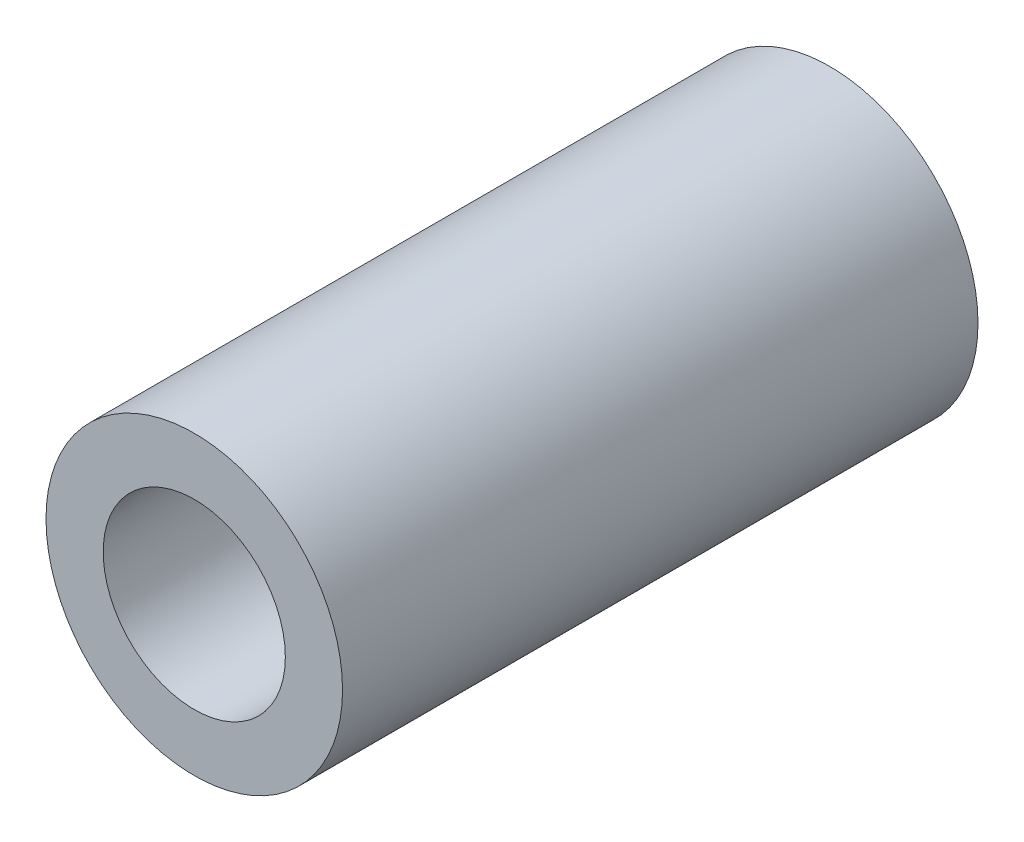
ISO-10303-21;
HEADER;
FILE_DESCRIPTION(('STEP AP214'),'2;1');
FILE_NAME('part.step','',(''),(''),'','','');
FILE_SCHEMA(('AUTOMOTIVE_DESIGN { 1 0 10303 214 1 1 1 1 }'));
ENDSEC;
DATA;
#1=APPLICATION_CONTEXT('core data for automotive mechanical design processes');
#2=APPLICATION_PROTOCOL_DEFINITION('international standard','automotive_design',2000,#1);
#3=PRODUCT_CONTEXT('',#1,'mechanical');
#4=PRODUCT('Part','Part','',(#3));
#5=PRODUCT_RELATED_PRODUCT_CATEGORY('part','',(#4));
#6=PRODUCT_DEFINITION_FORMATION('','',#4);
#7=PRODUCT_DEFINITION_CONTEXT('part definition',#1,'design');
#8=PRODUCT_DEFINITION('design','',#6,#7);
#9=PRODUCT_DEFINITION_SHAPE('','',#8);
#10=(LENGTH_UNIT() NAMED_UNIT(*) SI_UNIT(.MILLI.,.METRE.));
#11=(NAMED_UNIT(*) PLANE_ANGLE_UNIT() SI_UNIT($,.RADIAN.));
#12=(NAMED_UNIT(*) SI_UNIT($,.STERADIAN.) SOLID_ANGLE_UNIT());
#13=UNCERTAINTY_MEASURE_WITH_UNIT(LENGTH_MEASURE(1.E-05),#10,'distance_accuracy_value','');
#14=(GEOMETRIC_REPRESENTATION_CONTEXT(3) GLOBAL_UNCERTAINTY_ASSIGNED_CONTEXT((#13)) GLOBAL_UNIT_ASSIGNED_CONTEXT((#10,
#11,#12)) REPRESENTATION_CONTEXT('',''));
#15=CARTESIAN_POINT('',(0.,0.,0.));
#16=DIRECTION('',(0.,0.,1.));
#17=DIRECTION('',(1.,0.,0.));
#18=AXIS2_PLACEMENT_3D('',#15,#16,#17);
#19=CARTESIAN_POINT('',(0.,0.,15.));
#20=DIRECTION('',(0.,0.,1.));
#21=DIRECTION('',(1.,0.,0.));
#22=AXIS2_PLACEMENT_3D('',#19,#20,#21);
#23=PLANE('',#22);
#24=CARTESIAN_POINT('',(0.,0.,15.));
#25=DIRECTION('',(0.,0.,1.));
#26=DIRECTION('',(1.,0.,0.));
#27=AXIS2_PLACEMENT_3D('',#24,#25,#26);
#28=CIRCLE('',#27,3.5);
#29=CARTESIAN_POINT('',(3.5,0.,15.));
#30=VERTEX_POINT('',#29);
#31=EDGE_CURVE('E10',#30,#30,#28,.T.);
#32=ORIENTED_EDGE('',*,*,#31,.T.);
#33=EDGE_LOOP('',(#32));
#34=FACE_BOUND('',#33,.T.);
#35=CARTESIAN_POINT('',(0.,0.,15.));
#36=DIRECTION('',(0.,0.,1.));
#37=DIRECTION('',(1.,0.,0.));
#38=AXIS2_PLACEMENT_3D('',#35,#36,#37);
#39=CIRCLE('',#38,2.15);
#40=CARTESIAN_POINT('',(2.15,0.,15.));
#41=VERTEX_POINT('',#40);
#42=EDGE_CURVE('E44',#41,#41,#39,.T.);
#43=ORIENTED_EDGE('',*,*,#42,.F.);
#44=EDGE_LOOP('',(#43));
#45=FACE_BOUND('',#44,.T.);
#46=ADVANCED_FACE('F33',(#34,#45),#23,.T.);
#47=CARTESIAN_POINT('',(0.,0.,0.));
#48=DIRECTION('',(0.,0.,1.));
#49=DIRECTION('',(1.,0.,0.));
#50=AXIS2_PLACEMENT_3D('',#47,#48,#49);
#51=PLANE('',#50);
#52=CARTESIAN_POINT('',(0.,0.,0.));
#53=DIRECTION('',(0.,0.,1.));
#54=DIRECTION('',(1.,0.,0.));
#55=AXIS2_PLACEMENT_3D('',#52,#53,#54);
#56=CIRCLE('',#55,3.5);
#57=CARTESIAN_POINT('',(3.5,0.,0.));
#58=VERTEX_POINT('',#57);
#59=EDGE_CURVE('E37',#58,#58,#56,.T.);
#60=ORIENTED_EDGE('',*,*,#59,.F.);
#61=EDGE_LOOP('',(#60));
#62=FACE_BOUND('',#61,.T.);
#63=CARTESIAN_POINT('',(0.,0.,0.));
#64=DIRECTION('',(0.,0.,1.));
#65=DIRECTION('',(1.,0.,0.));
#66=AXIS2_PLACEMENT_3D('',#63,#64,#65);
#67=CIRCLE('',#66,2.15);
#68=CARTESIAN_POINT('',(2.15,0.,0.));
#69=VERTEX_POINT('',#68);
#70=EDGE_CURVE('E46',#69,#69,#67,.T.);
#71=ORIENTED_EDGE('',*,*,#70,.T.);
#72=EDGE_LOOP('',(#71));
#73=FACE_BOUND('',#72,.T.);
#74=ADVANCED_FACE('F56',(#62,#73),#51,.F.);
#75=CARTESIAN_POINT('',(0.,0.,15.));
#76=DIRECTION('',(0.,0.,-1.));
#77=DIRECTION('',(-1.,0.,0.));
#78=AXIS2_PLACEMENT_3D('',#75,#76,#77);
#79=CYLINDRICAL_SURFACE('',#78,3.5);
#80=ORIENTED_EDGE('',*,*,#31,.F.);
#81=EDGE_LOOP('',(#80));
#82=FACE_BOUND('',#81,.T.);
#83=ORIENTED_EDGE('',*,*,#59,.T.);
#84=EDGE_LOOP('',(#83));
#85=FACE_BOUND('',#84,.T.);
#86=ADVANCED_FACE('F35',(#82,#85),#79,.T.);
#87=CARTESIAN_POINT('',(0.,0.,15.));
#88=DIRECTION('',(0.,0.,-1.));
#89=DIRECTION('',(-1.,0.,0.));
#90=AXIS2_PLACEMENT_3D('',#87,#88,#89);
#91=CYLINDRICAL_SURFACE('',#90,2.15);
#92=ORIENTED_EDGE('',*,*,#42,.T.);
#93=EDGE_LOOP('',(#92));
#94=FACE_BOUND('',#93,.T.);
#95=ORIENTED_EDGE('',*,*,#70,.F.);
#96=EDGE_LOOP('',(#95));
#97=FACE_BOUND('',#96,.T.);
#98=ADVANCED_FACE('F52',(#94,#97),#91,.F.);
#99=CLOSED_SHELL('',(#46,#74,#86,#98));
#100=MANIFOLD_SOLID_BREP('B2',#99);
#101=ADVANCED_BREP_SHAPE_REPRESENTATION('',(#18,#100),#14);
#102=SHAPE_DEFINITION_REPRESENTATION(#9,#101);
ENDSEC;
END-ISO-10303-21;
